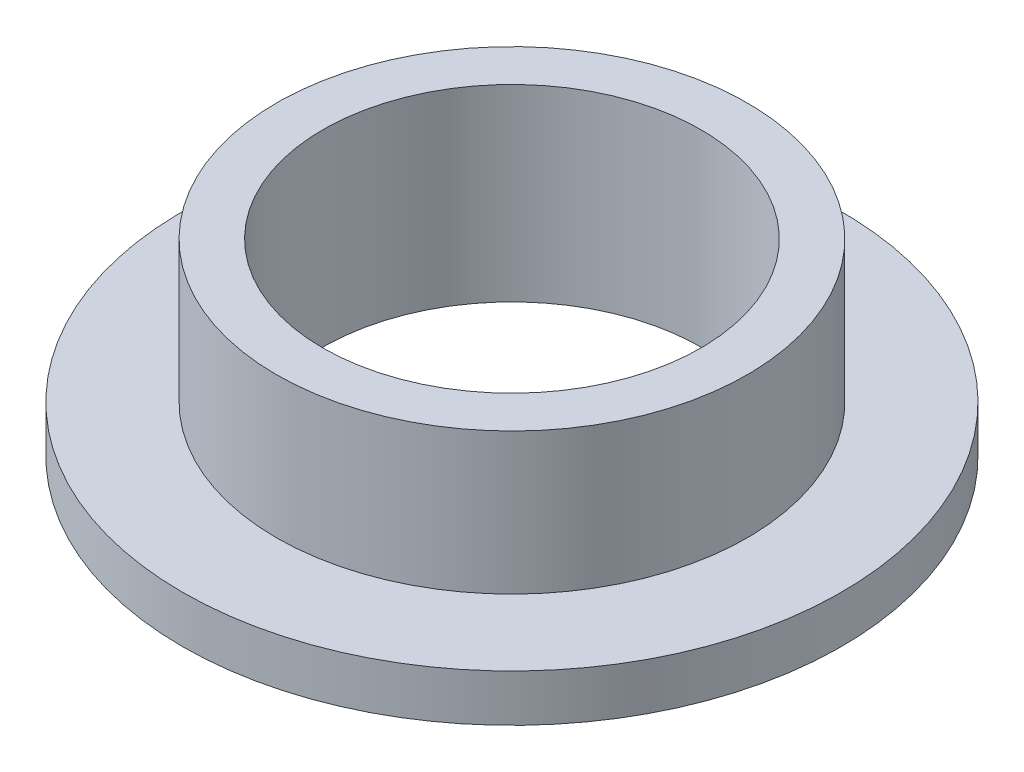
ISO-10303-21;
HEADER;
FILE_DESCRIPTION(('STEP AP214'),'2;1');
FILE_NAME('part.step','',(''),(''),'','','');
FILE_SCHEMA(('AUTOMOTIVE_DESIGN { 1 0 10303 214 1 1 1 1 }'));
ENDSEC;
DATA;
#1=APPLICATION_CONTEXT('core data for automotive mechanical design processes');
#2=APPLICATION_PROTOCOL_DEFINITION('international standard','automotive_design',2000,#1);
#3=PRODUCT_CONTEXT('',#1,'mechanical');
#4=PRODUCT('Part','Part','',(#3));
#5=PRODUCT_RELATED_PRODUCT_CATEGORY('part','',(#4));
#6=PRODUCT_DEFINITION_FORMATION('','',#4);
#7=PRODUCT_DEFINITION_CONTEXT('part definition',#1,'design');
#8=PRODUCT_DEFINITION('design','',#6,#7);
#9=PRODUCT_DEFINITION_SHAPE('','',#8);
#10=(LENGTH_UNIT() NAMED_UNIT(*) SI_UNIT(.MILLI.,.METRE.));
#11=(NAMED_UNIT(*) PLANE_ANGLE_UNIT() SI_UNIT($,.RADIAN.));
#12=(NAMED_UNIT(*) SI_UNIT($,.STERADIAN.) SOLID_ANGLE_UNIT());
#13=UNCERTAINTY_MEASURE_WITH_UNIT(LENGTH_MEASURE(1.E-05),#10,'distance_accuracy_value','');
#14=(GEOMETRIC_REPRESENTATION_CONTEXT(3) GLOBAL_UNCERTAINTY_ASSIGNED_CONTEXT((#13)) GLOBAL_UNIT_ASSIGNED_CONTEXT((#10,
#11,#12)) REPRESENTATION_CONTEXT('',''));
#15=CARTESIAN_POINT('',(0.,0.,0.));
#16=DIRECTION('',(0.,0.,1.));
#17=DIRECTION('',(1.,0.,0.));
#18=AXIS2_PLACEMENT_3D('',#15,#16,#17);
#19=CARTESIAN_POINT('',(0.,6.35,0.));
#20=DIRECTION('',(0.,1.,0.));
#21=DIRECTION('',(0.,0.,1.));
#22=AXIS2_PLACEMENT_3D('',#19,#20,#21);
#23=PLANE('',#22);
#24=CARTESIAN_POINT('',(0.,6.35,0.));
#25=DIRECTION('',(0.,1.,0.));
#26=DIRECTION('',(0.,0.,1.));
#27=AXIS2_PLACEMENT_3D('',#24,#25,#26);
#28=CIRCLE('',#27,7.9375);
#29=CARTESIAN_POINT('',(0.,6.35,7.9375));
#30=VERTEX_POINT('',#29);
#31=EDGE_CURVE('E10',#30,#30,#28,.T.);
#32=ORIENTED_EDGE('',*,*,#31,.T.);
#33=EDGE_LOOP('',(#32));
#34=FACE_BOUND('',#33,.T.);
#35=CARTESIAN_POINT('',(0.,6.35,0.));
#36=DIRECTION('',(0.,1.,0.));
#37=DIRECTION('',(0.,0.,1.));
#38=AXIS2_PLACEMENT_3D('',#35,#36,#37);
#39=CIRCLE('',#38,6.3754);
#40=CARTESIAN_POINT('',(0.,6.35,6.3754));
#41=VERTEX_POINT('',#40);
#42=EDGE_CURVE('E37',#41,#41,#39,.T.);
#43=ORIENTED_EDGE('',*,*,#42,.F.);
#44=EDGE_LOOP('',(#43));
#45=FACE_BOUND('',#44,.T.);
#46=ADVANCED_FACE('F30',(#34,#45),#23,.T.);
#47=CARTESIAN_POINT('',(0.,0.,0.));
#48=DIRECTION('',(0.,1.,0.));
#49=DIRECTION('',(0.,0.,1.));
#50=AXIS2_PLACEMENT_3D('',#47,#48,#49);
#51=PLANE('',#50);
#52=CARTESIAN_POINT('',(0.,0.,0.));
#53=DIRECTION('',(0.,1.,0.));
#54=DIRECTION('',(0.,0.,1.));
#55=AXIS2_PLACEMENT_3D('',#52,#53,#54);
#56=CIRCLE('',#55,6.3754);
#57=CARTESIAN_POINT('',(0.,0.,6.3754));
#58=VERTEX_POINT('',#57);
#59=EDGE_CURVE('E41',#58,#58,#56,.T.);
#60=ORIENTED_EDGE('',*,*,#59,.T.);
#61=EDGE_LOOP('',(#60));
#62=FACE_BOUND('',#61,.T.);
#63=CARTESIAN_POINT('',(0.,0.,0.));
#64=DIRECTION('',(0.,1.,0.));
#65=DIRECTION('',(0.,0.,1.));
#66=AXIS2_PLACEMENT_3D('',#63,#64,#65);
#67=CIRCLE('',#66,11.1125);
#68=CARTESIAN_POINT('',(0.,0.,11.1125));
#69=VERTEX_POINT('',#68);
#70=EDGE_CURVE('E48',#69,#69,#67,.T.);
#71=ORIENTED_EDGE('',*,*,#70,.F.);
#72=EDGE_LOOP('',(#71));
#73=FACE_BOUND('',#72,.T.);
#74=ADVANCED_FACE('F73',(#62,#73),#51,.F.);
#75=CARTESIAN_POINT('',(0.,6.35,0.));
#76=DIRECTION('',(0.,-1.,0.));
#77=DIRECTION('',(0.,0.,-1.));
#78=AXIS2_PLACEMENT_3D('',#75,#76,#77);
#79=CYLINDRICAL_SURFACE('',#78,7.9375);
#80=CARTESIAN_POINT('',(0.,1.5875,0.));
#81=DIRECTION('',(0.,1.,0.));
#82=DIRECTION('',(0.,0.,1.));
#83=AXIS2_PLACEMENT_3D('',#80,#81,#82);
#84=CIRCLE('',#83,7.9375);
#85=CARTESIAN_POINT('',(0.,1.5875,7.9375));
#86=VERTEX_POINT('',#85);
#87=EDGE_CURVE('E51',#86,#86,#84,.T.);
#88=ORIENTED_EDGE('',*,*,#87,.T.);
#89=EDGE_LOOP('',(#88));
#90=FACE_BOUND('',#89,.T.);
#91=ORIENTED_EDGE('',*,*,#31,.F.);
#92=EDGE_LOOP('',(#91));
#93=FACE_BOUND('',#92,.T.);
#94=ADVANCED_FACE('F32',(#90,#93),#79,.T.);
#95=CARTESIAN_POINT('',(0.,6.35,0.));
#96=DIRECTION('',(0.,-1.,0.));
#97=DIRECTION('',(0.,0.,-1.));
#98=AXIS2_PLACEMENT_3D('',#95,#96,#97);
#99=CYLINDRICAL_SURFACE('',#98,6.3754);
#100=ORIENTED_EDGE('',*,*,#42,.T.);
#101=EDGE_LOOP('',(#100));
#102=FACE_BOUND('',#101,.T.);
#103=ORIENTED_EDGE('',*,*,#59,.F.);
#104=EDGE_LOOP('',(#103));
#105=FACE_BOUND('',#104,.T.);
#106=ADVANCED_FACE('F62',(#102,#105),#99,.F.);
#107=CARTESIAN_POINT('',(0.,1.5875,0.));
#108=DIRECTION('',(0.,1.,0.));
#109=DIRECTION('',(0.,0.,1.));
#110=AXIS2_PLACEMENT_3D('',#107,#108,#109);
#111=PLANE('',#110);
#112=CARTESIAN_POINT('',(0.,1.5875,0.));
#113=DIRECTION('',(0.,1.,0.));
#114=DIRECTION('',(0.,0.,1.));
#115=AXIS2_PLACEMENT_3D('',#112,#113,#114);
#116=CIRCLE('',#115,11.1125);
#117=CARTESIAN_POINT('',(0.,1.5875,11.1125));
#118=VERTEX_POINT('',#117);
#119=EDGE_CURVE('E46',#118,#118,#116,.T.);
#120=ORIENTED_EDGE('',*,*,#119,.T.);
#121=EDGE_LOOP('',(#120));
#122=FACE_BOUND('',#121,.T.);
#123=ORIENTED_EDGE('',*,*,#87,.F.);
#124=EDGE_LOOP('',(#123));
#125=FACE_BOUND('',#124,.T.);
#126=ADVANCED_FACE('F59',(#122,#125),#111,.T.);
#127=CARTESIAN_POINT('',(0.,1.5875,0.));
#128=DIRECTION('',(0.,-1.,0.));
#129=DIRECTION('',(0.,0.,-1.));
#130=AXIS2_PLACEMENT_3D('',#127,#128,#129);
#131=CYLINDRICAL_SURFACE('',#130,11.1125);
#132=ORIENTED_EDGE('',*,*,#119,.F.);
#133=EDGE_LOOP('',(#132));
#134=FACE_BOUND('',#133,.T.);
#135=ORIENTED_EDGE('',*,*,#70,.T.);
#136=EDGE_LOOP('',(#135));
#137=FACE_BOUND('',#136,.T.);
#138=ADVANCED_FACE('F61',(#134,#137),#131,.T.);
#139=CLOSED_SHELL('',(#46,#74,#94,#106,#126,#138));
#140=MANIFOLD_SOLID_BREP('B2',#139);
#141=ADVANCED_BREP_SHAPE_REPRESENTATION('',(#18,#140),#14);
#142=SHAPE_DEFINITION_REPRESENTATION(#9,#141);
ENDSEC;
END-ISO-10303-21;
